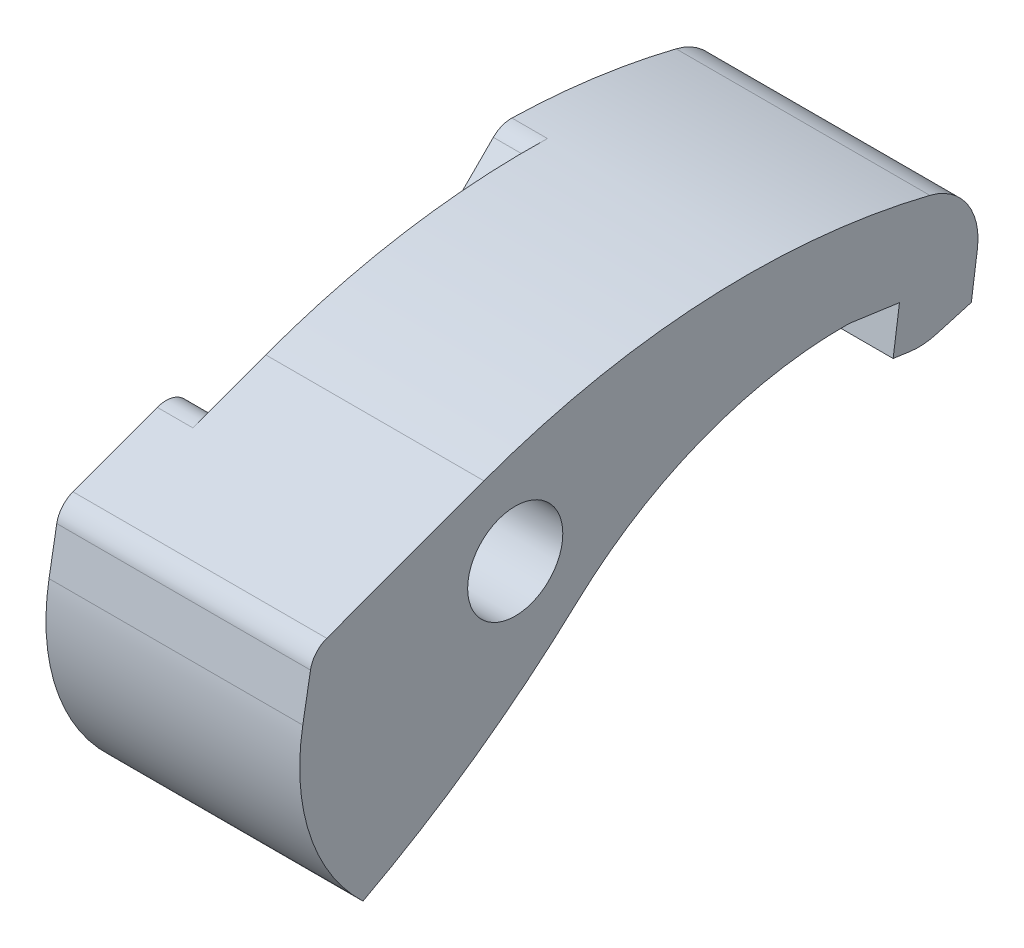
ISO-10303-21;
HEADER;
FILE_DESCRIPTION(('STEP AP214'),'2;1');
FILE_NAME('part.step','',(''),(''),'','','');
FILE_SCHEMA(('AUTOMOTIVE_DESIGN { 1 0 10303 214 1 1 1 1 }'));
ENDSEC;
DATA;
#1=APPLICATION_CONTEXT('core data for automotive mechanical design processes');
#2=APPLICATION_PROTOCOL_DEFINITION('international standard','automotive_design',2000,#1);
#3=PRODUCT_CONTEXT('',#1,'mechanical');
#4=PRODUCT('Part','Part','',(#3));
#5=PRODUCT_RELATED_PRODUCT_CATEGORY('part','',(#4));
#6=PRODUCT_DEFINITION_FORMATION('','',#4);
#7=PRODUCT_DEFINITION_CONTEXT('part definition',#1,'design');
#8=PRODUCT_DEFINITION('design','',#6,#7);
#9=PRODUCT_DEFINITION_SHAPE('','',#8);
#10=(LENGTH_UNIT() NAMED_UNIT(*) SI_UNIT(.MILLI.,.METRE.));
#11=(NAMED_UNIT(*) PLANE_ANGLE_UNIT() SI_UNIT($,.RADIAN.));
#12=(NAMED_UNIT(*) SI_UNIT($,.STERADIAN.) SOLID_ANGLE_UNIT());
#13=UNCERTAINTY_MEASURE_WITH_UNIT(LENGTH_MEASURE(1.E-05),#10,'distance_accuracy_value','');
#14=(GEOMETRIC_REPRESENTATION_CONTEXT(3) GLOBAL_UNCERTAINTY_ASSIGNED_CONTEXT((#13)) GLOBAL_UNIT_ASSIGNED_CONTEXT((#10,
#11,#12)) REPRESENTATION_CONTEXT('',''));
#15=CARTESIAN_POINT('',(0.,0.,0.));
#16=DIRECTION('',(0.,0.,1.));
#17=DIRECTION('',(1.,0.,0.));
#18=AXIS2_PLACEMENT_3D('',#15,#16,#17);
#19=CARTESIAN_POINT('',(3.175,0.,0.));
#20=DIRECTION('',(-1.,0.,0.));
#21=DIRECTION('',(0.,0.,1.));
#22=AXIS2_PLACEMENT_3D('',#19,#20,#21);
#23=CYLINDRICAL_SURFACE('',#22,1.190625);
#24=CARTESIAN_POINT('',(3.175,0.,0.));
#25=DIRECTION('',(1.,0.,0.));
#26=DIRECTION('',(0.,0.,-1.));
#27=AXIS2_PLACEMENT_3D('',#24,#25,#26);
#28=CIRCLE('',#27,1.190625);
#29=CARTESIAN_POINT('',(3.175,0.,-1.190625));
#30=VERTEX_POINT('',#29);
#31=EDGE_CURVE('E562',#30,#30,#28,.T.);
#32=ORIENTED_EDGE('',*,*,#31,.T.);
#33=EDGE_LOOP('',(#32));
#34=FACE_BOUND('',#33,.T.);
#35=CARTESIAN_POINT('',(-2.286,0.,0.));
#36=DIRECTION('',(-1.,0.,0.));
#37=DIRECTION('',(0.,0.,1.));
#38=AXIS2_PLACEMENT_3D('',#35,#36,#37);
#39=CIRCLE('',#38,1.190625);
#40=CARTESIAN_POINT('',(-2.286,0.,1.190625));
#41=VERTEX_POINT('',#40);
#42=EDGE_CURVE('E526',#41,#41,#39,.T.);
#43=ORIENTED_EDGE('',*,*,#42,.T.);
#44=EDGE_LOOP('',(#43));
#45=FACE_BOUND('',#44,.T.);
#46=ADVANCED_FACE('F372',(#34,#45),#23,.F.);
#47=CARTESIAN_POINT('',(3.175,1.19825646920004,-9.99343223914784));
#48=DIRECTION('',(1.,0.,0.));
#49=DIRECTION('',(0.,0.,-1.));
#50=AXIS2_PLACEMENT_3D('',#47,#48,#49);
#51=PLANE('',#50);
#52=DIRECTION('',(0.,-0.344877348089507,0.938647758626605));
#53=VECTOR('',#52,1.);
#54=CARTESIAN_POINT('',(3.175,2.13123283361109,0.783056179554005));
#55=LINE('',#54,#53);
#56=CARTESIAN_POINT('',(3.175,2.13123283361109,0.783056179554005));
#57=VERTEX_POINT('',#56);
#58=CARTESIAN_POINT('',(3.175,0.685929087384338,4.71671876842977));
#59=VERTEX_POINT('',#58);
#60=EDGE_CURVE('E546',#57,#59,#55,.T.);
#61=ORIENTED_EDGE('',*,*,#60,.T.);
#62=CARTESIAN_POINT('',(3.175,0.0898877606564437,4.49772165239294));
#63=DIRECTION('',(1.,0.,0.));
#64=DIRECTION('',(0.,0.,-1.));
#65=AXIS2_PLACEMENT_3D('',#62,#63,#64);
#66=CIRCLE('',#65,0.635);
#67=CARTESIAN_POINT('',(3.175,0.200154353474941,5.12307457555569));
#68=VERTEX_POINT('',#67);
#69=EDGE_CURVE('E637',#59,#68,#66,.T.);
#70=ORIENTED_EDGE('',*,*,#69,.T.);
#71=DIRECTION('',(0.,-0.984807753012209,0.173648177666925));
#72=VECTOR('',#71,1.);
#73=CARTESIAN_POINT('',(3.175,0.559934818620441,5.0596355724187));
#74=LINE('',#73,#72);
#75=CARTESIAN_POINT('',(3.175,-0.89615702198718,5.31638385030726));
#76=VERTEX_POINT('',#75);
#77=EDGE_CURVE('E549',#68,#76,#74,.T.);
#78=ORIENTED_EDGE('',*,*,#77,.T.);
#79=CARTESIAN_POINT('',(3.175,-1.77828976453515,0.313560465005237));
#80=DIRECTION('',(1.,0.,0.));
#81=DIRECTION('',(0.,0.,1.));
#82=AXIS2_PLACEMENT_3D('',#79,#80,#81);
#83=CIRCLE('',#82,5.08);
#84=CARTESIAN_POINT('',(3.175,-5.46357273577707,3.81));
#85=VERTEX_POINT('',#84);
#86=EDGE_CURVE('E551',#76,#85,#83,.T.);
#87=ORIENTED_EDGE('',*,*,#86,.T.);
#88=CARTESIAN_POINT('',(3.175,16.7177164556112,15.5235938516393));
#89=DIRECTION('',(1.,0.,0.));
#90=DIRECTION('',(0.,0.,1.));
#91=AXIS2_PLACEMENT_3D('',#88,#89,#90);
#92=CIRCLE('',#91,25.084215576995);
#93=CARTESIAN_POINT('',(3.175,-1.66383346176161,-1.54498821449293));
#94=VERTEX_POINT('',#93);
#95=EDGE_CURVE('E554',#85,#94,#92,.T.);
#96=ORIENTED_EDGE('',*,*,#95,.T.);
#97=CARTESIAN_POINT('',(3.175,-8.89,-8.255));
#98=DIRECTION('',(-1.,0.,0.));
#99=DIRECTION('',(0.,0.,-1.));
#100=AXIS2_PLACEMENT_3D('',#97,#98,#99);
#101=CIRCLE('',#100,9.86112270484452);
#102=CARTESIAN_POINT('',(3.175,0.97093910475821,-8.31517451495798));
#103=VERTEX_POINT('',#102);
#104=EDGE_CURVE('E592',#94,#103,#101,.T.);
#105=ORIENTED_EDGE('',*,*,#104,.T.);
#106=CARTESIAN_POINT('',(3.175,0.3359509275555,-8.31129961976176));
#107=DIRECTION('',(1.,0.,0.));
#108=DIRECTION('',(0.,0.,-1.));
#109=AXIS2_PLACEMENT_3D('',#106,#107,#108);
#110=CIRCLE('',#109,0.635);
#111=CARTESIAN_POINT('',(3.175,0.964771151206397,-8.3996745388714));
#112=VERTEX_POINT('',#111);
#113=EDGE_CURVE('E650',#103,#112,#110,.F.);
#114=ORIENTED_EDGE('',*,*,#113,.T.);
#115=DIRECTION('',(0.,-0.139173100960066,-0.99026806874157));
#116=VECTOR('',#115,1.);
#117=CARTESIAN_POINT('',(3.175,0.793831444223816,-9.61597375428848));
#118=LINE('',#117,#116);
#119=CARTESIAN_POINT('',(3.175,0.793831444223816,-9.61597375428848));
#120=VERTEX_POINT('',#119);
#121=EDGE_CURVE('E595',#112,#120,#118,.T.);
#122=ORIENTED_EDGE('',*,*,#121,.T.);
#123=DIRECTION('',(0.,-0.99026806874157,0.139173100960066));
#124=VECTOR('',#123,1.);
#125=CARTESIAN_POINT('',(3.175,-0.338044958347799,-9.45689889989113));
#126=LINE('',#125,#124);
#127=CARTESIAN_POINT('',(3.175,-0.338044958347799,-9.45689889989113));
#128=VERTEX_POINT('',#127);
#129=EDGE_CURVE('E597',#120,#128,#126,.T.);
#130=ORIENTED_EDGE('',*,*,#129,.T.);
#131=DIRECTION('',(0.,-0.139173100960067,-0.99026806874157));
#132=VECTOR('',#131,1.);
#133=CARTESIAN_POINT('',(3.175,-0.338044958347799,-9.45689889989113));
#134=LINE('',#133,#132);
#135=CARTESIAN_POINT('',(3.175,-0.397208774048546,-9.87787132278893));
#136=VERTEX_POINT('',#135);
#137=EDGE_CURVE('E599',#128,#136,#134,.T.);
#138=ORIENTED_EDGE('',*,*,#137,.T.);
#139=CARTESIAN_POINT('',(3.175,1.1748417850787,-10.098808620563));
#140=DIRECTION('',(1.,0.,0.));
#141=DIRECTION('',(0.,0.,1.));
#142=AXIS2_PLACEMENT_3D('',#139,#140,#141);
#143=CIRCLE('',#142,1.5875);
#144=CARTESIAN_POINT('',(3.175,-0.351447306078678,-10.5353837689785));
#145=VERTEX_POINT('',#144);
#146=EDGE_CURVE('E601',#136,#145,#143,.T.);
#147=ORIENTED_EDGE('',*,*,#146,.T.);
#148=DIRECTION('',(0.,0.275007967505811,-0.961441947185748));
#149=VECTOR('',#148,1.);
#150=CARTESIAN_POINT('',(3.175,-0.351447306078678,-10.5353837689785));
#151=LINE('',#150,#149);
#152=CARTESIAN_POINT('',(3.175,-0.100113536756007,-11.4140595061315));
#153=VERTEX_POINT('',#152);
#154=EDGE_CURVE('E603',#145,#153,#151,.T.);
#155=ORIENTED_EDGE('',*,*,#154,.T.);
#156=DIRECTION('',(0.,0.99026806874157,-0.139173100960066));
#157=VECTOR('',#156,1.);
#158=CARTESIAN_POINT('',(3.175,-0.100113536756007,-11.4140595061315));
#159=LINE('',#158,#157);
#160=CARTESIAN_POINT('',(3.175,0.977319171425933,-11.5654827982751));
#161=VERTEX_POINT('',#160);
#162=EDGE_CURVE('E605',#153,#161,#159,.T.);
#163=ORIENTED_EDGE('',*,*,#162,.T.);
#164=CARTESIAN_POINT('',(3.175,1.19825646920004,-9.99343223914784));
#165=DIRECTION('',(1.,0.,0.));
#166=DIRECTION('',(0.,0.,-1.));
#167=AXIS2_PLACEMENT_3D('',#164,#165,#166);
#168=CIRCLE('',#167,1.5875);
#169=CARTESIAN_POINT('',(3.175,2.73900769078419,-10.3758481425657));
#170=VERTEX_POINT('',#169);
#171=EDGE_CURVE('E586',#161,#170,#168,.T.);
#172=ORIENTED_EDGE('',*,*,#171,.T.);
#173=CARTESIAN_POINT('',(3.175,-15.7500069682257,-5.7868573015511));
#174=DIRECTION('',(1.,0.,0.));
#175=DIRECTION('',(0.,0.,-1.));
#176=AXIS2_PLACEMENT_3D('',#173,#174,#175);
#177=CIRCLE('',#176,19.05);
#178=EDGE_CURVE('E589',#170,#57,#177,.T.);
#179=ORIENTED_EDGE('',*,*,#178,.T.);
#180=EDGE_LOOP('',(#61,#70,#78,#87,#96,#105,#114,#122,#130,#138,#147,#155,#163,#172,#179));
#181=FACE_BOUND('',#180,.T.);
#182=ORIENTED_EDGE('',*,*,#31,.F.);
#183=EDGE_LOOP('',(#182));
#184=FACE_BOUND('',#183,.T.);
#185=ADVANCED_FACE('F687',(#181,#184),#51,.T.);
#186=CARTESIAN_POINT('',(-3.175,1.19825646920004,-9.99343223914784));
#187=DIRECTION('',(1.,0.,0.));
#188=DIRECTION('',(0.,0.,-1.));
#189=AXIS2_PLACEMENT_3D('',#186,#187,#188);
#190=PLANE('',#189);
#191=DIRECTION('',(0.,0.344877348089507,-0.938647758626605));
#192=VECTOR('',#191,1.);
#193=CARTESIAN_POINT('',(-3.175,2.13123283361109,0.783056179554005));
#194=LINE('',#193,#192);
#195=CARTESIAN_POINT('',(-3.175,0.685929087384338,4.71671876842977));
#196=VERTEX_POINT('',#195);
#197=CARTESIAN_POINT('',(-3.175,1.46101409156984,2.60718096911048));
#198=VERTEX_POINT('',#197);
#199=EDGE_CURVE('E545',#196,#198,#194,.T.);
#200=ORIENTED_EDGE('',*,*,#199,.T.);
#201=CARTESIAN_POINT('',(-3.175,0.864972764841943,2.38818385307365));
#202=DIRECTION('',(1.,0.,0.));
#203=DIRECTION('',(0.,0.,-1.));
#204=AXIS2_PLACEMENT_3D('',#201,#202,#203);
#205=CIRCLE('',#204,0.635);
#206=CARTESIAN_POINT('',(-3.175,0.648729573631457,1.79113788980523));
#207=VERTEX_POINT('',#206);
#208=EDGE_CURVE('E531',#198,#207,#205,.F.);
#209=ORIENTED_EDGE('',*,*,#208,.T.);
#210=CARTESIAN_POINT('',(-3.175,0.,0.));
#211=DIRECTION('',(-1.,0.,0.));
#212=DIRECTION('',(0.,0.,1.));
#213=AXIS2_PLACEMENT_3D('',#210,#211,#212);
#214=CIRCLE('',#213,1.905);
#215=CARTESIAN_POINT('',(-3.175,-1.34703841816037,-1.34703841816038));
#216=VERTEX_POINT('',#215);
#217=EDGE_CURVE('E519',#216,#207,#214,.T.);
#218=ORIENTED_EDGE('',*,*,#217,.F.);
#219=DIRECTION('',(0.,-0.707106781186549,0.707106781186546));
#220=VECTOR('',#219,1.);
#221=CARTESIAN_POINT('',(-3.175,-1.34703841816037,-1.34703841816038));
#222=LINE('',#221,#220);
#223=CARTESIAN_POINT('',(-3.175,3.10814960945004,-5.80222644577076));
#224=VERTEX_POINT('',#223);
#225=EDGE_CURVE('E509',#224,#216,#222,.T.);
#226=ORIENTED_EDGE('',*,*,#225,.F.);
#227=CARTESIAN_POINT('',(-3.175,2.65913680339658,-6.25123925182422));
#228=DIRECTION('',(1.,0.,0.));
#229=DIRECTION('',(0.,0.,-1.));
#230=AXIS2_PLACEMENT_3D('',#227,#228,#229);
#231=CIRCLE('',#230,0.635);
#232=CARTESIAN_POINT('',(-3.175,3.293934864487,-6.26725242252329));
#233=VERTEX_POINT('',#232);
#234=EDGE_CURVE('E660',#224,#233,#231,.F.);
#235=ORIENTED_EDGE('',*,*,#234,.T.);
#236=CARTESIAN_POINT('',(-3.175,-15.7500069682257,-5.7868573015511));
#237=DIRECTION('',(1.,0.,0.));
#238=DIRECTION('',(0.,0.,-1.));
#239=AXIS2_PLACEMENT_3D('',#236,#237,#238);
#240=CIRCLE('',#239,19.05);
#241=CARTESIAN_POINT('',(-3.175,2.73900769078419,-10.3758481425657));
#242=VERTEX_POINT('',#241);
#243=EDGE_CURVE('E568',#242,#233,#240,.T.);
#244=ORIENTED_EDGE('',*,*,#243,.F.);
#245=CARTESIAN_POINT('',(-3.175,1.19825646920004,-9.99343223914784));
#246=DIRECTION('',(1.,0.,0.));
#247=DIRECTION('',(0.,0.,-1.));
#248=AXIS2_PLACEMENT_3D('',#245,#246,#247);
#249=CIRCLE('',#248,1.5875);
#250=CARTESIAN_POINT('',(-3.175,0.977319171425933,-11.5654827982751));
#251=VERTEX_POINT('',#250);
#252=EDGE_CURVE('E565',#251,#242,#249,.T.);
#253=ORIENTED_EDGE('',*,*,#252,.F.);
#254=DIRECTION('',(0.,0.99026806874157,-0.139173100960066));
#255=VECTOR('',#254,1.);
#256=CARTESIAN_POINT('',(-3.175,-0.100113536756007,-11.4140595061315));
#257=LINE('',#256,#255);
#258=CARTESIAN_POINT('',(-3.175,-0.100113536756007,-11.4140595061315));
#259=VERTEX_POINT('',#258);
#260=EDGE_CURVE('E584',#259,#251,#257,.T.);
#261=ORIENTED_EDGE('',*,*,#260,.F.);
#262=DIRECTION('',(0.,0.275007967505811,-0.961441947185748));
#263=VECTOR('',#262,1.);
#264=CARTESIAN_POINT('',(-3.175,-0.351447306078678,-10.5353837689785));
#265=LINE('',#264,#263);
#266=CARTESIAN_POINT('',(-3.175,-0.351447306078678,-10.5353837689785));
#267=VERTEX_POINT('',#266);
#268=EDGE_CURVE('E582',#267,#259,#265,.T.);
#269=ORIENTED_EDGE('',*,*,#268,.F.);
#270=CARTESIAN_POINT('',(-3.175,1.1748417850787,-10.098808620563));
#271=DIRECTION('',(1.,0.,0.));
#272=DIRECTION('',(0.,0.,1.));
#273=AXIS2_PLACEMENT_3D('',#270,#271,#272);
#274=CIRCLE('',#273,1.5875);
#275=CARTESIAN_POINT('',(-3.175,-0.397208774048546,-9.87787132278893));
#276=VERTEX_POINT('',#275);
#277=EDGE_CURVE('E580',#276,#267,#274,.T.);
#278=ORIENTED_EDGE('',*,*,#277,.F.);
#279=DIRECTION('',(0.,-0.139173100960067,-0.99026806874157));
#280=VECTOR('',#279,1.);
#281=CARTESIAN_POINT('',(-3.175,-0.338044958347799,-9.45689889989113));
#282=LINE('',#281,#280);
#283=CARTESIAN_POINT('',(-3.175,-0.338044958347799,-9.45689889989113));
#284=VERTEX_POINT('',#283);
#285=EDGE_CURVE('E578',#284,#276,#282,.T.);
#286=ORIENTED_EDGE('',*,*,#285,.F.);
#287=DIRECTION('',(0.,-0.99026806874157,0.139173100960066));
#288=VECTOR('',#287,1.);
#289=CARTESIAN_POINT('',(-3.175,-0.338044958347799,-9.45689889989113));
#290=LINE('',#289,#288);
#291=CARTESIAN_POINT('',(-3.175,0.793831444223816,-9.61597375428848));
#292=VERTEX_POINT('',#291);
#293=EDGE_CURVE('E576',#292,#284,#290,.T.);
#294=ORIENTED_EDGE('',*,*,#293,.F.);
#295=DIRECTION('',(0.,-0.139173100960066,-0.99026806874157));
#296=VECTOR('',#295,1.);
#297=CARTESIAN_POINT('',(-3.175,0.793831444223816,-9.61597375428848));
#298=LINE('',#297,#296);
#299=CARTESIAN_POINT('',(-3.175,0.964771151206397,-8.3996745388714));
#300=VERTEX_POINT('',#299);
#301=EDGE_CURVE('E574',#300,#292,#298,.T.);
#302=ORIENTED_EDGE('',*,*,#301,.F.);
#303=CARTESIAN_POINT('',(-3.175,0.3359509275555,-8.31129961976176));
#304=DIRECTION('',(1.,0.,0.));
#305=DIRECTION('',(0.,0.,-1.));
#306=AXIS2_PLACEMENT_3D('',#303,#304,#305);
#307=CIRCLE('',#306,0.635);
#308=CARTESIAN_POINT('',(-3.175,0.97093910475821,-8.31517451495798));
#309=VERTEX_POINT('',#308);
#310=EDGE_CURVE('E648',#300,#309,#307,.T.);
#311=ORIENTED_EDGE('',*,*,#310,.T.);
#312=CARTESIAN_POINT('',(-3.175,-8.89,-8.255));
#313=DIRECTION('',(-1.,0.,0.));
#314=DIRECTION('',(0.,0.,-1.));
#315=AXIS2_PLACEMENT_3D('',#312,#313,#314);
#316=CIRCLE('',#315,9.86112270484452);
#317=CARTESIAN_POINT('',(-3.175,-1.66383346176161,-1.54498821449292));
#318=VERTEX_POINT('',#317);
#319=EDGE_CURVE('E571',#318,#309,#316,.T.);
#320=ORIENTED_EDGE('',*,*,#319,.F.);
#321=CARTESIAN_POINT('',(-3.175,16.7177164556112,15.5235938516393));
#322=DIRECTION('',(1.,0.,0.));
#323=DIRECTION('',(0.,0.,-1.));
#324=AXIS2_PLACEMENT_3D('',#321,#322,#323);
#325=CIRCLE('',#324,25.084215576995);
#326=CARTESIAN_POINT('',(-3.175,-5.46357273577707,3.81));
#327=VERTEX_POINT('',#326);
#328=EDGE_CURVE('E543',#318,#327,#325,.F.);
#329=ORIENTED_EDGE('',*,*,#328,.T.);
#330=CARTESIAN_POINT('',(-3.175,-1.77828976453515,0.313560465005237));
#331=DIRECTION('',(1.,0.,0.));
#332=DIRECTION('',(0.,0.,-1.));
#333=AXIS2_PLACEMENT_3D('',#330,#331,#332);
#334=CIRCLE('',#333,5.08);
#335=CARTESIAN_POINT('',(-3.175,-0.89615702198718,5.31638385030726));
#336=VERTEX_POINT('',#335);
#337=EDGE_CURVE('E540',#327,#336,#334,.F.);
#338=ORIENTED_EDGE('',*,*,#337,.T.);
#339=DIRECTION('',(0.,0.984807753012209,-0.173648177666925));
#340=VECTOR('',#339,1.);
#341=CARTESIAN_POINT('',(-3.175,0.559934818620441,5.0596355724187));
#342=LINE('',#341,#340);
#343=CARTESIAN_POINT('',(-3.175,0.200154353474941,5.12307457555569));
#344=VERTEX_POINT('',#343);
#345=EDGE_CURVE('E537',#336,#344,#342,.T.);
#346=ORIENTED_EDGE('',*,*,#345,.T.);
#347=CARTESIAN_POINT('',(-3.175,0.0898877606564437,4.49772165239294));
#348=DIRECTION('',(1.,0.,0.));
#349=DIRECTION('',(0.,0.,-1.));
#350=AXIS2_PLACEMENT_3D('',#347,#348,#349);
#351=CIRCLE('',#350,0.635);
#352=EDGE_CURVE('E641',#344,#196,#351,.F.);
#353=ORIENTED_EDGE('',*,*,#352,.T.);
#354=EDGE_LOOP('',(#200,#209,#218,#226,#235,#244,#253,#261,#269,#278,#286,#294,#302,#311,#320,
#329,#338,#346,#353));
#355=FACE_BOUND('',#354,.T.);
#356=ADVANCED_FACE('F530',(#355),#190,.F.);
#357=CARTESIAN_POINT('',(3.175,1.19825646920004,-9.99343223914784));
#358=DIRECTION('',(-1.,0.,0.));
#359=DIRECTION('',(0.,0.,1.));
#360=AXIS2_PLACEMENT_3D('',#357,#358,#359);
#361=CYLINDRICAL_SURFACE('',#360,1.5875);
#362=ORIENTED_EDGE('',*,*,#252,.T.);
#363=DIRECTION('',(-1.,0.,0.));
#364=VECTOR('',#363,1.);
#365=CARTESIAN_POINT('',(3.175,2.73900769078419,-10.3758481425657));
#366=LINE('',#365,#364);
#367=EDGE_CURVE('E631',#170,#242,#366,.T.);
#368=ORIENTED_EDGE('',*,*,#367,.F.);
#369=ORIENTED_EDGE('',*,*,#171,.F.);
#370=DIRECTION('',(-1.,0.,0.));
#371=VECTOR('',#370,1.);
#372=CARTESIAN_POINT('',(3.175,0.977319171425933,-11.5654827982751));
#373=LINE('',#372,#371);
#374=EDGE_CURVE('E607',#161,#251,#373,.T.);
#375=ORIENTED_EDGE('',*,*,#374,.T.);
#376=EDGE_LOOP('',(#362,#368,#369,#375));
#377=FACE_BOUND('',#376,.T.);
#378=ADVANCED_FACE('F374',(#377),#361,.T.);
#379=CARTESIAN_POINT('',(3.175,-15.7500069682257,-5.7868573015511));
#380=DIRECTION('',(-1.,0.,0.));
#381=DIRECTION('',(0.,0.,1.));
#382=AXIS2_PLACEMENT_3D('',#379,#380,#381);
#383=CYLINDRICAL_SURFACE('',#382,19.05);
#384=CARTESIAN_POINT('',(-2.286,-15.7500069682257,-5.7868573015511));
#385=DIRECTION('',(-1.,0.,0.));
#386=DIRECTION('',(0.,0.,-1.));
#387=AXIS2_PLACEMENT_3D('',#384,#385,#386);
#388=CIRCLE('',#387,19.05);
#389=CARTESIAN_POINT('',(-2.286,2.13123283361109,0.783056179554003));
#390=VERTEX_POINT('',#389);
#391=CARTESIAN_POINT('',(-2.286,3.29393486448701,-6.26725242252329));
#392=VERTEX_POINT('',#391);
#393=EDGE_CURVE('E387',#390,#392,#388,.T.);
#394=ORIENTED_EDGE('',*,*,#393,.F.);
#395=DIRECTION('',(-1.,0.,0.));
#396=VECTOR('',#395,1.);
#397=CARTESIAN_POINT('',(3.175,2.13123283361109,0.783056179554003));
#398=LINE('',#397,#396);
#399=EDGE_CURVE('E628',#57,#390,#398,.T.);
#400=ORIENTED_EDGE('',*,*,#399,.F.);
#401=ORIENTED_EDGE('',*,*,#178,.F.);
#402=ORIENTED_EDGE('',*,*,#367,.T.);
#403=ORIENTED_EDGE('',*,*,#243,.T.);
#404=DIRECTION('',(-1.,0.,0.));
#405=VECTOR('',#404,1.);
#406=CARTESIAN_POINT('',(3.175,3.293934864487,-6.26725242252329));
#407=LINE('',#406,#405);
#408=EDGE_CURVE('E665',#233,#392,#407,.F.);
#409=ORIENTED_EDGE('',*,*,#408,.T.);
#410=EDGE_LOOP('',(#394,#400,#401,#402,#403,#409));
#411=FACE_BOUND('',#410,.T.);
#412=ADVANCED_FACE('F729',(#411),#383,.T.);
#413=CARTESIAN_POINT('',(3.175,-8.89,-8.255));
#414=DIRECTION('',(-1.,0.,0.));
#415=DIRECTION('',(0.,0.,1.));
#416=AXIS2_PLACEMENT_3D('',#413,#414,#415);
#417=CYLINDRICAL_SURFACE('',#416,9.86112270484452);
#418=ORIENTED_EDGE('',*,*,#319,.T.);
#419=DIRECTION('',(-1.,0.,0.));
#420=VECTOR('',#419,1.);
#421=CARTESIAN_POINT('',(3.175,0.97093910475821,-8.31517451495798));
#422=LINE('',#421,#420);
#423=EDGE_CURVE('E646',#309,#103,#422,.F.);
#424=ORIENTED_EDGE('',*,*,#423,.T.);
#425=ORIENTED_EDGE('',*,*,#104,.F.);
#426=DIRECTION('',(-1.,0.,0.));
#427=VECTOR('',#426,1.);
#428=CARTESIAN_POINT('',(3.175,-1.66383346176161,-1.54498821449292));
#429=LINE('',#428,#427);
#430=EDGE_CURVE('E625',#94,#318,#429,.T.);
#431=ORIENTED_EDGE('',*,*,#430,.T.);
#432=EDGE_LOOP('',(#418,#424,#425,#431));
#433=FACE_BOUND('',#432,.T.);
#434=ADVANCED_FACE('F726',(#433),#417,.F.);
#435=CARTESIAN_POINT('',(3.175,0.793831444223816,-9.61597375428848));
#436=DIRECTION('',(0.,0.99026806874157,-0.139173100960066));
#437=DIRECTION('',(0.,0.139173100960066,0.99026806874157));
#438=AXIS2_PLACEMENT_3D('',#435,#436,#437);
#439=PLANE('',#438);
#440=ORIENTED_EDGE('',*,*,#121,.F.);
#441=DIRECTION('',(1.,0.,0.));
#442=VECTOR('',#441,1.);
#443=CARTESIAN_POINT('',(-3.175,0.964771151206397,-8.3996745388714));
#444=LINE('',#443,#442);
#445=EDGE_CURVE('E643',#112,#300,#444,.F.);
#446=ORIENTED_EDGE('',*,*,#445,.T.);
#447=ORIENTED_EDGE('',*,*,#301,.T.);
#448=DIRECTION('',(-1.,0.,0.));
#449=VECTOR('',#448,1.);
#450=CARTESIAN_POINT('',(3.175,0.793831444223816,-9.61597375428848));
#451=LINE('',#450,#449);
#452=EDGE_CURVE('E622',#120,#292,#451,.T.);
#453=ORIENTED_EDGE('',*,*,#452,.F.);
#454=EDGE_LOOP('',(#440,#446,#447,#453));
#455=FACE_BOUND('',#454,.T.);
#456=ADVANCED_FACE('F722',(#455),#439,.F.);
#457=CARTESIAN_POINT('',(3.175,-0.338044958347799,-9.45689889989113));
#458=DIRECTION('',(0.,-0.139173100960066,-0.99026806874157));
#459=DIRECTION('',(0.,0.99026806874157,-0.139173100960066));
#460=AXIS2_PLACEMENT_3D('',#457,#458,#459);
#461=PLANE('',#460);
#462=ORIENTED_EDGE('',*,*,#293,.T.);
#463=DIRECTION('',(-1.,0.,0.));
#464=VECTOR('',#463,1.);
#465=CARTESIAN_POINT('',(3.175,-0.338044958347799,-9.45689889989113));
#466=LINE('',#465,#464);
#467=EDGE_CURVE('E619',#128,#284,#466,.T.);
#468=ORIENTED_EDGE('',*,*,#467,.F.);
#469=ORIENTED_EDGE('',*,*,#129,.F.);
#470=ORIENTED_EDGE('',*,*,#452,.T.);
#471=EDGE_LOOP('',(#462,#468,#469,#470));
#472=FACE_BOUND('',#471,.T.);
#473=ADVANCED_FACE('F718',(#472),#461,.F.);
#474=CARTESIAN_POINT('',(3.175,-0.338044958347799,-9.45689889989113));
#475=DIRECTION('',(0.,0.99026806874157,-0.139173100960067));
#476=DIRECTION('',(0.,0.139173100960067,0.99026806874157));
#477=AXIS2_PLACEMENT_3D('',#474,#475,#476);
#478=PLANE('',#477);
#479=ORIENTED_EDGE('',*,*,#285,.T.);
#480=DIRECTION('',(-1.,0.,0.));
#481=VECTOR('',#480,1.);
#482=CARTESIAN_POINT('',(3.175,-0.397208774048546,-9.87787132278893));
#483=LINE('',#482,#481);
#484=EDGE_CURVE('E616',#136,#276,#483,.T.);
#485=ORIENTED_EDGE('',*,*,#484,.F.);
#486=ORIENTED_EDGE('',*,*,#137,.F.);
#487=ORIENTED_EDGE('',*,*,#467,.T.);
#488=EDGE_LOOP('',(#479,#485,#486,#487));
#489=FACE_BOUND('',#488,.T.);
#490=ADVANCED_FACE('F714',(#489),#478,.F.);
#491=CARTESIAN_POINT('',(3.175,1.1748417850787,-10.098808620563));
#492=DIRECTION('',(-1.,0.,0.));
#493=DIRECTION('',(0.,0.,1.));
#494=AXIS2_PLACEMENT_3D('',#491,#492,#493);
#495=CYLINDRICAL_SURFACE('',#494,1.5875);
#496=ORIENTED_EDGE('',*,*,#277,.T.);
#497=DIRECTION('',(-1.,0.,0.));
#498=VECTOR('',#497,1.);
#499=CARTESIAN_POINT('',(3.175,-0.351447306078678,-10.5353837689785));
#500=LINE('',#499,#498);
#501=EDGE_CURVE('E613',#145,#267,#500,.T.);
#502=ORIENTED_EDGE('',*,*,#501,.F.);
#503=ORIENTED_EDGE('',*,*,#146,.F.);
#504=ORIENTED_EDGE('',*,*,#484,.T.);
#505=EDGE_LOOP('',(#496,#502,#503,#504));
#506=FACE_BOUND('',#505,.T.);
#507=ADVANCED_FACE('F710',(#506),#495,.T.);
#508=CARTESIAN_POINT('',(3.175,-0.351447306078678,-10.5353837689785));
#509=DIRECTION('',(0.,0.961441947185748,0.275007967505811));
#510=DIRECTION('',(0.,-0.275007967505811,0.961441947185748));
#511=AXIS2_PLACEMENT_3D('',#508,#509,#510);
#512=PLANE('',#511);
#513=ORIENTED_EDGE('',*,*,#268,.T.);
#514=DIRECTION('',(-1.,0.,0.));
#515=VECTOR('',#514,1.);
#516=CARTESIAN_POINT('',(3.175,-0.100113536756007,-11.4140595061315));
#517=LINE('',#516,#515);
#518=EDGE_CURVE('E610',#153,#259,#517,.T.);
#519=ORIENTED_EDGE('',*,*,#518,.F.);
#520=ORIENTED_EDGE('',*,*,#154,.F.);
#521=ORIENTED_EDGE('',*,*,#501,.T.);
#522=EDGE_LOOP('',(#513,#519,#520,#521));
#523=FACE_BOUND('',#522,.T.);
#524=ADVANCED_FACE('F706',(#523),#512,.F.);
#525=CARTESIAN_POINT('',(3.175,-0.100113536756007,-11.4140595061315));
#526=DIRECTION('',(0.,0.139173100960066,0.99026806874157));
#527=DIRECTION('',(0.,-0.99026806874157,0.139173100960066));
#528=AXIS2_PLACEMENT_3D('',#525,#526,#527);
#529=PLANE('',#528);
#530=ORIENTED_EDGE('',*,*,#260,.T.);
#531=ORIENTED_EDGE('',*,*,#374,.F.);
#532=ORIENTED_EDGE('',*,*,#162,.F.);
#533=ORIENTED_EDGE('',*,*,#518,.T.);
#534=EDGE_LOOP('',(#530,#531,#532,#533));
#535=FACE_BOUND('',#534,.T.);
#536=ADVANCED_FACE('F702',(#535),#529,.F.);
#537=CARTESIAN_POINT('',(-13.4621050064911,16.7177164556112,15.5235938516393));
#538=DIRECTION('',(1.,0.,0.));
#539=DIRECTION('',(0.,0.,-1.));
#540=AXIS2_PLACEMENT_3D('',#537,#538,#539);
#541=CYLINDRICAL_SURFACE('',#540,25.084215576995);
#542=ORIENTED_EDGE('',*,*,#328,.F.);
#543=ORIENTED_EDGE('',*,*,#430,.F.);
#544=ORIENTED_EDGE('',*,*,#95,.F.);
#545=DIRECTION('',(1.,0.,0.));
#546=VECTOR('',#545,1.);
#547=CARTESIAN_POINT('',(-13.4621050064911,-5.46357273577707,3.81));
#548=LINE('',#547,#546);
#549=EDGE_CURVE('E541',#327,#85,#548,.T.);
#550=ORIENTED_EDGE('',*,*,#549,.F.);
#551=EDGE_LOOP('',(#542,#543,#544,#550));
#552=FACE_BOUND('',#551,.T.);
#553=ADVANCED_FACE('F705',(#552),#541,.T.);
#554=CARTESIAN_POINT('',(-13.4621050064911,-1.77828976453515,0.313560465005237));
#555=DIRECTION('',(1.,0.,0.));
#556=DIRECTION('',(0.,0.,-1.));
#557=AXIS2_PLACEMENT_3D('',#554,#555,#556);
#558=CYLINDRICAL_SURFACE('',#557,5.08);
#559=ORIENTED_EDGE('',*,*,#337,.F.);
#560=ORIENTED_EDGE('',*,*,#549,.T.);
#561=ORIENTED_EDGE('',*,*,#86,.F.);
#562=DIRECTION('',(1.,0.,0.));
#563=VECTOR('',#562,1.);
#564=CARTESIAN_POINT('',(-13.4621050064911,-0.89615702198718,5.31638385030726));
#565=LINE('',#564,#563);
#566=EDGE_CURVE('E557',#336,#76,#565,.T.);
#567=ORIENTED_EDGE('',*,*,#566,.F.);
#568=EDGE_LOOP('',(#559,#560,#561,#567));
#569=FACE_BOUND('',#568,.T.);
#570=ADVANCED_FACE('F777',(#569),#558,.T.);
#571=CARTESIAN_POINT('',(-13.4621050064911,0.559934818620441,5.0596355724187));
#572=DIRECTION('',(0.,0.173648177666925,0.984807753012209));
#573=DIRECTION('',(0.,-0.984807753012209,0.173648177666925));
#574=AXIS2_PLACEMENT_3D('',#571,#572,#573);
#575=PLANE('',#574);
#576=ORIENTED_EDGE('',*,*,#77,.F.);
#577=DIRECTION('',(1.,0.,0.));
#578=VECTOR('',#577,1.);
#579=CARTESIAN_POINT('',(-13.4621050064911,0.200154353474941,5.12307457555569));
#580=LINE('',#579,#578);
#581=EDGE_CURVE('E639',#68,#344,#580,.F.);
#582=ORIENTED_EDGE('',*,*,#581,.T.);
#583=ORIENTED_EDGE('',*,*,#345,.F.);
#584=ORIENTED_EDGE('',*,*,#566,.T.);
#585=EDGE_LOOP('',(#576,#582,#583,#584));
#586=FACE_BOUND('',#585,.T.);
#587=ADVANCED_FACE('F780',(#586),#575,.T.);
#588=CARTESIAN_POINT('',(-13.4621050064911,2.13123283361109,0.783056179554005));
#589=DIRECTION('',(0.,0.938647758626605,0.344877348089507));
#590=DIRECTION('',(0.,-0.344877348089507,0.938647758626605));
#591=AXIS2_PLACEMENT_3D('',#588,#589,#590);
#592=PLANE('',#591);
#593=DIRECTION('',(0.,-0.344877348089507,0.938647758626605));
#594=VECTOR('',#593,1.);
#595=CARTESIAN_POINT('',(-2.286,2.13123283361109,0.783056179554005));
#596=LINE('',#595,#594);
#597=CARTESIAN_POINT('',(-2.286,1.46101409156984,2.60718096911048));
#598=VERTEX_POINT('',#597);
#599=EDGE_CURVE('E652',#390,#598,#596,.T.);
#600=ORIENTED_EDGE('',*,*,#599,.T.);
#601=DIRECTION('',(1.,0.,0.));
#602=VECTOR('',#601,1.);
#603=CARTESIAN_POINT('',(-3.175,1.46101409156984,2.60718096911048));
#604=LINE('',#603,#602);
#605=EDGE_CURVE('E657',#598,#198,#604,.F.);
#606=ORIENTED_EDGE('',*,*,#605,.T.);
#607=ORIENTED_EDGE('',*,*,#199,.F.);
#608=DIRECTION('',(1.,0.,0.));
#609=VECTOR('',#608,1.);
#610=CARTESIAN_POINT('',(-13.4621050064911,0.685929087384338,4.71671876842977));
#611=LINE('',#610,#609);
#612=EDGE_CURVE('E634',#196,#59,#611,.T.);
#613=ORIENTED_EDGE('',*,*,#612,.T.);
#614=ORIENTED_EDGE('',*,*,#60,.F.);
#615=ORIENTED_EDGE('',*,*,#399,.T.);
#616=EDGE_LOOP('',(#600,#606,#607,#613,#614,#615));
#617=FACE_BOUND('',#616,.T.);
#618=ADVANCED_FACE('F672',(#617),#592,.T.);
#619=CARTESIAN_POINT('',(-13.4621050064911,0.0898877606564437,4.49772165239294));
#620=DIRECTION('',(1.,0.,0.));
#621=DIRECTION('',(0.,0.,-1.));
#622=AXIS2_PLACEMENT_3D('',#619,#620,#621);
#623=CYLINDRICAL_SURFACE('',#622,0.635);
#624=ORIENTED_EDGE('',*,*,#352,.F.);
#625=ORIENTED_EDGE('',*,*,#581,.F.);
#626=ORIENTED_EDGE('',*,*,#69,.F.);
#627=ORIENTED_EDGE('',*,*,#612,.F.);
#628=EDGE_LOOP('',(#624,#625,#626,#627));
#629=FACE_BOUND('',#628,.T.);
#630=ADVANCED_FACE('F785',(#629),#623,.T.);
#631=CARTESIAN_POINT('',(3.175,0.3359509275555,-8.31129961976176));
#632=DIRECTION('',(-1.,0.,0.));
#633=DIRECTION('',(0.,0.,1.));
#634=AXIS2_PLACEMENT_3D('',#631,#632,#633);
#635=CYLINDRICAL_SURFACE('',#634,0.635);
#636=ORIENTED_EDGE('',*,*,#113,.F.);
#637=ORIENTED_EDGE('',*,*,#423,.F.);
#638=ORIENTED_EDGE('',*,*,#310,.F.);
#639=ORIENTED_EDGE('',*,*,#445,.F.);
#640=EDGE_LOOP('',(#636,#637,#638,#639));
#641=FACE_BOUND('',#640,.T.);
#642=ADVANCED_FACE('F766',(#641),#635,.F.);
#643=CARTESIAN_POINT('',(-2.286,0.,0.));
#644=DIRECTION('',(-1.,0.,0.));
#645=DIRECTION('',(0.,0.,1.));
#646=AXIS2_PLACEMENT_3D('',#643,#644,#645);
#647=CYLINDRICAL_SURFACE('',#646,1.905);
#648=ORIENTED_EDGE('',*,*,#217,.T.);
#649=DIRECTION('',(-1.,0.,0.));
#650=VECTOR('',#649,1.);
#651=CARTESIAN_POINT('',(-2.286,0.648729573631457,1.79113788980523));
#652=LINE('',#651,#650);
#653=CARTESIAN_POINT('',(-2.286,0.648729573631457,1.79113788980523));
#654=VERTEX_POINT('',#653);
#655=EDGE_CURVE('E663',#207,#654,#652,.F.);
#656=ORIENTED_EDGE('',*,*,#655,.T.);
#657=CARTESIAN_POINT('',(-2.286,0.,0.));
#658=DIRECTION('',(-1.,0.,0.));
#659=DIRECTION('',(0.,0.,1.));
#660=AXIS2_PLACEMENT_3D('',#657,#658,#659);
#661=CIRCLE('',#660,1.905);
#662=CARTESIAN_POINT('',(-2.286,-1.34703841816037,-1.34703841816038));
#663=VERTEX_POINT('',#662);
#664=EDGE_CURVE('E518',#663,#654,#661,.T.);
#665=ORIENTED_EDGE('',*,*,#664,.F.);
#666=DIRECTION('',(-1.,0.,0.));
#667=VECTOR('',#666,1.);
#668=CARTESIAN_POINT('',(-2.286,-1.34703841816037,-1.34703841816038));
#669=LINE('',#668,#667);
#670=EDGE_CURVE('E512',#663,#216,#669,.T.);
#671=ORIENTED_EDGE('',*,*,#670,.T.);
#672=EDGE_LOOP('',(#648,#656,#665,#671));
#673=FACE_BOUND('',#672,.T.);
#674=ADVANCED_FACE('F523',(#673),#647,.F.);
#675=CARTESIAN_POINT('',(-2.286,-1.34703841816037,-1.34703841816038));
#676=DIRECTION('',(0.,-0.707106781186546,-0.707106781186549));
#677=DIRECTION('',(0.,0.707106781186549,-0.707106781186546));
#678=AXIS2_PLACEMENT_3D('',#675,#676,#677);
#679=PLANE('',#678);
#680=DIRECTION('',(0.,-0.707106781186549,0.707106781186546));
#681=VECTOR('',#680,1.);
#682=CARTESIAN_POINT('',(-2.286,-1.34703841816037,-1.34703841816038));
#683=LINE('',#682,#681);
#684=CARTESIAN_POINT('',(-2.286,3.10814960945004,-5.80222644577076));
#685=VERTEX_POINT('',#684);
#686=EDGE_CURVE('E527',#685,#663,#683,.T.);
#687=ORIENTED_EDGE('',*,*,#686,.F.);
#688=DIRECTION('',(-1.,0.,0.));
#689=VECTOR('',#688,1.);
#690=CARTESIAN_POINT('',(-2.286,3.10814960945004,-5.80222644577076));
#691=LINE('',#690,#689);
#692=EDGE_CURVE('E515',#685,#224,#691,.T.);
#693=ORIENTED_EDGE('',*,*,#692,.T.);
#694=ORIENTED_EDGE('',*,*,#225,.T.);
#695=ORIENTED_EDGE('',*,*,#670,.F.);
#696=EDGE_LOOP('',(#687,#693,#694,#695));
#697=FACE_BOUND('',#696,.T.);
#698=ADVANCED_FACE('F511',(#697),#679,.F.);
#699=CARTESIAN_POINT('',(-2.286,0.,0.));
#700=DIRECTION('',(-1.,0.,0.));
#701=DIRECTION('',(0.,0.,1.));
#702=AXIS2_PLACEMENT_3D('',#699,#700,#701);
#703=PLANE('',#702);
#704=ORIENTED_EDGE('',*,*,#42,.F.);
#705=EDGE_LOOP('',(#704));
#706=FACE_BOUND('',#705,.T.);
#707=ORIENTED_EDGE('',*,*,#664,.T.);
#708=CARTESIAN_POINT('',(-2.286,0.864972764841943,2.38818385307365));
#709=DIRECTION('',(-1.,0.,0.));
#710=DIRECTION('',(0.,0.,1.));
#711=AXIS2_PLACEMENT_3D('',#708,#709,#710);
#712=CIRCLE('',#711,0.635);
#713=EDGE_CURVE('E380',#654,#598,#712,.F.);
#714=ORIENTED_EDGE('',*,*,#713,.T.);
#715=ORIENTED_EDGE('',*,*,#599,.F.);
#716=ORIENTED_EDGE('',*,*,#393,.T.);
#717=CARTESIAN_POINT('',(-2.286,2.65913680339658,-6.25123925182422));
#718=DIRECTION('',(-1.,0.,0.));
#719=DIRECTION('',(0.,0.,1.));
#720=AXIS2_PLACEMENT_3D('',#717,#718,#719);
#721=CIRCLE('',#720,0.635);
#722=EDGE_CURVE('E11',#392,#685,#721,.F.);
#723=ORIENTED_EDGE('',*,*,#722,.T.);
#724=ORIENTED_EDGE('',*,*,#686,.T.);
#725=EDGE_LOOP('',(#707,#714,#715,#716,#723,#724));
#726=FACE_BOUND('',#725,.T.);
#727=ADVANCED_FACE('F668',(#706,#726),#703,.T.);
#728=CARTESIAN_POINT('',(-2.286,0.864972764841943,2.38818385307365));
#729=DIRECTION('',(-1.,0.,0.));
#730=DIRECTION('',(0.,0.,1.));
#731=AXIS2_PLACEMENT_3D('',#728,#729,#730);
#732=CYLINDRICAL_SURFACE('',#731,0.635);
#733=ORIENTED_EDGE('',*,*,#713,.F.);
#734=ORIENTED_EDGE('',*,*,#655,.F.);
#735=ORIENTED_EDGE('',*,*,#208,.F.);
#736=ORIENTED_EDGE('',*,*,#605,.F.);
#737=EDGE_LOOP('',(#733,#734,#735,#736));
#738=FACE_BOUND('',#737,.T.);
#739=ADVANCED_FACE('F674',(#738),#732,.T.);
#740=CARTESIAN_POINT('',(3.175,2.65913680339658,-6.25123925182422));
#741=DIRECTION('',(-1.,0.,0.));
#742=DIRECTION('',(0.,0.,1.));
#743=AXIS2_PLACEMENT_3D('',#740,#741,#742);
#744=CYLINDRICAL_SURFACE('',#743,0.635);
#745=ORIENTED_EDGE('',*,*,#722,.F.);
#746=ORIENTED_EDGE('',*,*,#408,.F.);
#747=ORIENTED_EDGE('',*,*,#234,.F.);
#748=ORIENTED_EDGE('',*,*,#692,.F.);
#749=EDGE_LOOP('',(#745,#746,#747,#748));
#750=FACE_BOUND('',#749,.T.);
#751=ADVANCED_FACE('F676',(#750),#744,.T.);
#752=CLOSED_SHELL('',(#46,#185,#356,#378,#412,#434,#456,#473,#490,#507,#524,#536,#553,#570,#587,
#618,#630,#642,#674,#698,#727,#739,#751));
#753=MANIFOLD_SOLID_BREP('B2',#752);
#754=ADVANCED_BREP_SHAPE_REPRESENTATION('',(#18,#753),#14);
#755=SHAPE_DEFINITION_REPRESENTATION(#9,#754);
ENDSEC;
END-ISO-10303-21;
